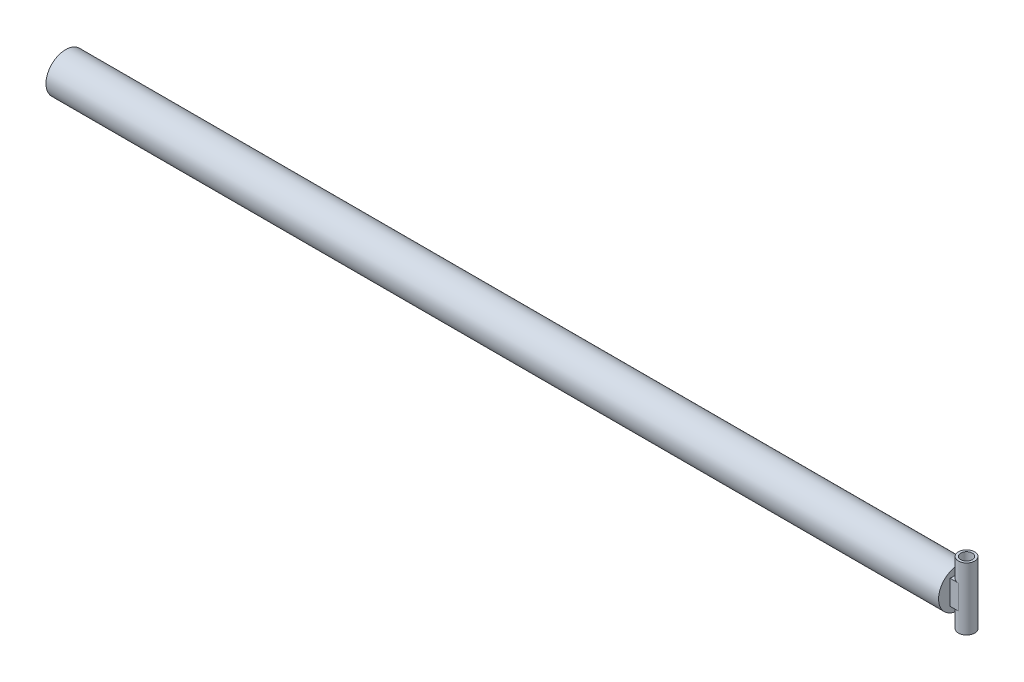
ISO-10303-21;
HEADER;
FILE_DESCRIPTION(('STEP AP214'),'2;1');
FILE_NAME('part.step','',(''),(''),'','','');
FILE_SCHEMA(('AUTOMOTIVE_DESIGN { 1 0 10303 214 1 1 1 1 }'));
ENDSEC;
DATA;
#1=APPLICATION_CONTEXT('core data for automotive mechanical design processes');
#2=APPLICATION_PROTOCOL_DEFINITION('international standard','automotive_design',2000,#1);
#3=PRODUCT_CONTEXT('',#1,'mechanical');
#4=PRODUCT('Part','Part','',(#3));
#5=PRODUCT_RELATED_PRODUCT_CATEGORY('part','',(#4));
#6=PRODUCT_DEFINITION_FORMATION('','',#4);
#7=PRODUCT_DEFINITION_CONTEXT('part definition',#1,'design');
#8=PRODUCT_DEFINITION('design','',#6,#7);
#9=PRODUCT_DEFINITION_SHAPE('','',#8);
#10=(LENGTH_UNIT() NAMED_UNIT(*) SI_UNIT(.MILLI.,.METRE.));
#11=(NAMED_UNIT(*) PLANE_ANGLE_UNIT() SI_UNIT($,.RADIAN.));
#12=(NAMED_UNIT(*) SI_UNIT($,.STERADIAN.) SOLID_ANGLE_UNIT());
#13=UNCERTAINTY_MEASURE_WITH_UNIT(LENGTH_MEASURE(1.E-05),#10,'distance_accuracy_value','');
#14=(GEOMETRIC_REPRESENTATION_CONTEXT(3) GLOBAL_UNCERTAINTY_ASSIGNED_CONTEXT((#13)) GLOBAL_UNIT_ASSIGNED_CONTEXT((#10,
#11,#12)) REPRESENTATION_CONTEXT('',''));
#15=CARTESIAN_POINT('',(0.,0.,0.));
#16=DIRECTION('',(0.,0.,1.));
#17=DIRECTION('',(1.,0.,0.));
#18=AXIS2_PLACEMENT_3D('',#15,#16,#17);
#19=CARTESIAN_POINT('',(1930.,0.,0.));
#20=DIRECTION('',(-1.,0.,0.));
#21=DIRECTION('',(0.,0.,1.));
#22=AXIS2_PLACEMENT_3D('',#19,#20,#21);
#23=PLANE('',#22);
#24=CARTESIAN_POINT('',(1930.,0.,0.));
#25=DIRECTION('',(1.,0.,0.));
#26=DIRECTION('',(0.,0.,-1.));
#27=AXIS2_PLACEMENT_3D('',#24,#25,#26);
#28=CIRCLE('',#27,84.9999999999995);
#29=CARTESIAN_POINT('',(1930.,0.,-84.9999999999995));
#30=VERTEX_POINT('',#29);
#31=EDGE_CURVE('E115',#30,#30,#28,.T.);
#32=ORIENTED_EDGE('',*,*,#31,.T.);
#33=EDGE_LOOP('',(#32));
#34=FACE_BOUND('',#33,.T.);
#35=DIRECTION('',(0.,0.,1.));
#36=VECTOR('',#35,1.);
#37=CARTESIAN_POINT('',(1930.,52.5,-35.));
#38=LINE('',#37,#36);
#39=CARTESIAN_POINT('',(1930.,52.5,-35.));
#40=VERTEX_POINT('',#39);
#41=CARTESIAN_POINT('',(1930.,52.5,35.));
#42=VERTEX_POINT('',#41);
#43=EDGE_CURVE('E63',#40,#42,#38,.T.);
#44=ORIENTED_EDGE('',*,*,#43,.F.);
#45=DIRECTION('',(0.,1.,0.));
#46=VECTOR('',#45,1.);
#47=CARTESIAN_POINT('',(1930.,52.5,-35.));
#48=LINE('',#47,#46);
#49=CARTESIAN_POINT('',(1930.,-52.5,-35.));
#50=VERTEX_POINT('',#49);
#51=EDGE_CURVE('E68',#50,#40,#48,.T.);
#52=ORIENTED_EDGE('',*,*,#51,.F.);
#53=DIRECTION('',(0.,0.,-1.));
#54=VECTOR('',#53,1.);
#55=CARTESIAN_POINT('',(1930.,-52.5,-35.));
#56=LINE('',#55,#54);
#57=CARTESIAN_POINT('',(1930.,-52.5,35.));
#58=VERTEX_POINT('',#57);
#59=EDGE_CURVE('E194',#58,#50,#56,.T.);
#60=ORIENTED_EDGE('',*,*,#59,.F.);
#61=DIRECTION('',(0.,-1.,0.));
#62=VECTOR('',#61,1.);
#63=CARTESIAN_POINT('',(1930.,52.5,35.));
#64=LINE('',#63,#62);
#65=EDGE_CURVE('E197',#42,#58,#64,.T.);
#66=ORIENTED_EDGE('',*,*,#65,.F.);
#67=EDGE_LOOP('',(#44,#52,#60,#66));
#68=FACE_BOUND('',#67,.T.);
#69=ADVANCED_FACE('F48',(#34,#68),#23,.F.);
#70=CARTESIAN_POINT('',(-1930.,0.,0.));
#71=DIRECTION('',(1.,0.,0.));
#72=DIRECTION('',(0.,0.,-1.));
#73=AXIS2_PLACEMENT_3D('',#70,#71,#72);
#74=PLANE('',#73);
#75=CARTESIAN_POINT('',(-1930.,0.,0.));
#76=DIRECTION('',(1.,0.,0.));
#77=DIRECTION('',(0.,0.,-1.));
#78=AXIS2_PLACEMENT_3D('',#75,#76,#77);
#79=CIRCLE('',#78,84.9999999999995);
#80=CARTESIAN_POINT('',(-1930.,0.,-84.9999999999995));
#81=VERTEX_POINT('',#80);
#82=EDGE_CURVE('E118',#81,#81,#79,.T.);
#83=ORIENTED_EDGE('',*,*,#82,.F.);
#84=EDGE_LOOP('',(#83));
#85=FACE_BOUND('',#84,.T.);
#86=CARTESIAN_POINT('',(-1930.,0.,0.));
#87=DIRECTION('',(-1.,0.,0.));
#88=DIRECTION('',(0.,0.,1.));
#89=AXIS2_PLACEMENT_3D('',#86,#87,#88);
#90=CIRCLE('',#89,18.75);
#91=CARTESIAN_POINT('',(-1930.,0.,18.75));
#92=VERTEX_POINT('',#91);
#93=EDGE_CURVE('E186',#92,#92,#90,.T.);
#94=ORIENTED_EDGE('',*,*,#93,.F.);
#95=EDGE_LOOP('',(#94));
#96=FACE_BOUND('',#95,.T.);
#97=ADVANCED_FACE('F50',(#85,#96),#74,.F.);
#98=CARTESIAN_POINT('',(-1930.,0.,0.));
#99=DIRECTION('',(-1.,0.,0.));
#100=DIRECTION('',(0.,0.,1.));
#101=AXIS2_PLACEMENT_3D('',#98,#99,#100);
#102=CYLINDRICAL_SURFACE('',#101,84.9999999999995);
#103=ORIENTED_EDGE('',*,*,#82,.T.);
#104=EDGE_LOOP('',(#103));
#105=FACE_BOUND('',#104,.T.);
#106=ORIENTED_EDGE('',*,*,#31,.F.);
#107=EDGE_LOOP('',(#106));
#108=FACE_BOUND('',#107,.T.);
#109=ADVANCED_FACE('F154',(#105,#108),#102,.T.);
#110=CARTESIAN_POINT('',(2001.002,52.5,35.));
#111=DIRECTION('',(0.,0.,-1.));
#112=DIRECTION('',(-1.,0.,0.));
#113=AXIS2_PLACEMENT_3D('',#110,#111,#112);
#114=PLANE('',#113);
#115=DIRECTION('',(-1.,0.,0.));
#116=VECTOR('',#115,1.);
#117=CARTESIAN_POINT('',(2001.002,-52.5,35.));
#118=LINE('',#117,#116);
#119=CARTESIAN_POINT('',(1966.,-52.5,35.));
#120=VERTEX_POINT('',#119);
#121=EDGE_CURVE('E204',#120,#58,#118,.T.);
#122=ORIENTED_EDGE('',*,*,#121,.F.);
#123=DIRECTION('',(0.,1.,0.));
#124=VECTOR('',#123,1.);
#125=CARTESIAN_POINT('',(1966.,-135.,34.9999999999997));
#126=LINE('',#125,#124);
#127=CARTESIAN_POINT('',(1966.,52.5,35.));
#128=VERTEX_POINT('',#127);
#129=EDGE_CURVE('E103',#120,#128,#126,.T.);
#130=ORIENTED_EDGE('',*,*,#129,.T.);
#131=DIRECTION('',(-1.,0.,0.));
#132=VECTOR('',#131,1.);
#133=CARTESIAN_POINT('',(2001.002,52.5,35.));
#134=LINE('',#133,#132);
#135=EDGE_CURVE('E100',#128,#42,#134,.T.);
#136=ORIENTED_EDGE('',*,*,#135,.T.);
#137=ORIENTED_EDGE('',*,*,#65,.T.);
#138=EDGE_LOOP('',(#122,#130,#136,#137));
#139=FACE_BOUND('',#138,.T.);
#140=ADVANCED_FACE('F159',(#139),#114,.F.);
#141=CARTESIAN_POINT('',(2001.002,52.5,-35.));
#142=DIRECTION('',(0.,-1.,0.));
#143=DIRECTION('',(0.,0.,-1.));
#144=AXIS2_PLACEMENT_3D('',#141,#142,#143);
#145=PLANE('',#144);
#146=ORIENTED_EDGE('',*,*,#135,.F.);
#147=CARTESIAN_POINT('',(1966.,52.5,0.));
#148=DIRECTION('',(0.,-1.,0.));
#149=DIRECTION('',(0.,0.,-1.));
#150=AXIS2_PLACEMENT_3D('',#147,#148,#149);
#151=CIRCLE('',#150,34.9999999999994);
#152=CARTESIAN_POINT('',(1966.,52.5,-34.9999999999997));
#153=VERTEX_POINT('',#152);
#154=EDGE_CURVE('E97',#128,#153,#151,.T.);
#155=ORIENTED_EDGE('',*,*,#154,.T.);
#156=DIRECTION('',(-1.,0.,0.));
#157=VECTOR('',#156,1.);
#158=CARTESIAN_POINT('',(2001.002,52.5,-35.));
#159=LINE('',#158,#157);
#160=EDGE_CURVE('E86',#153,#40,#159,.T.);
#161=ORIENTED_EDGE('',*,*,#160,.T.);
#162=ORIENTED_EDGE('',*,*,#43,.T.);
#163=EDGE_LOOP('',(#146,#155,#161,#162));
#164=FACE_BOUND('',#163,.T.);
#165=ADVANCED_FACE('F98',(#164),#145,.F.);
#166=CARTESIAN_POINT('',(2001.002,-52.5,-35.));
#167=DIRECTION('',(0.,1.,0.));
#168=DIRECTION('',(0.,0.,1.));
#169=AXIS2_PLACEMENT_3D('',#166,#167,#168);
#170=PLANE('',#169);
#171=DIRECTION('',(-1.,0.,0.));
#172=VECTOR('',#171,1.);
#173=CARTESIAN_POINT('',(2001.002,-52.5,-35.));
#174=LINE('',#173,#172);
#175=CARTESIAN_POINT('',(1966.,-52.5,-35.));
#176=VERTEX_POINT('',#175);
#177=EDGE_CURVE('E93',#176,#50,#174,.T.);
#178=ORIENTED_EDGE('',*,*,#177,.F.);
#179=CARTESIAN_POINT('',(1966.,-52.5,0.));
#180=DIRECTION('',(0.,1.,0.));
#181=DIRECTION('',(0.,0.,1.));
#182=AXIS2_PLACEMENT_3D('',#179,#180,#181);
#183=CIRCLE('',#182,34.9999999999994);
#184=EDGE_CURVE('E107',#176,#120,#183,.T.);
#185=ORIENTED_EDGE('',*,*,#184,.T.);
#186=ORIENTED_EDGE('',*,*,#121,.T.);
#187=ORIENTED_EDGE('',*,*,#59,.T.);
#188=EDGE_LOOP('',(#178,#185,#186,#187));
#189=FACE_BOUND('',#188,.T.);
#190=ADVANCED_FACE('F209',(#189),#170,.F.);
#191=CARTESIAN_POINT('',(2001.002,52.5,-35.));
#192=DIRECTION('',(0.,0.,1.));
#193=DIRECTION('',(1.,0.,0.));
#194=AXIS2_PLACEMENT_3D('',#191,#192,#193);
#195=PLANE('',#194);
#196=DIRECTION('',(0.,1.,0.));
#197=VECTOR('',#196,1.);
#198=CARTESIAN_POINT('',(1966.,-135.,-34.9999999999997));
#199=LINE('',#198,#197);
#200=EDGE_CURVE('E90',#176,#153,#199,.T.);
#201=ORIENTED_EDGE('',*,*,#200,.F.);
#202=ORIENTED_EDGE('',*,*,#177,.T.);
#203=ORIENTED_EDGE('',*,*,#51,.T.);
#204=ORIENTED_EDGE('',*,*,#160,.F.);
#205=EDGE_LOOP('',(#201,#202,#203,#204));
#206=FACE_BOUND('',#205,.T.);
#207=ADVANCED_FACE('F88',(#206),#195,.F.);
#208=CARTESIAN_POINT('',(1966.,-135.,0.));
#209=DIRECTION('',(0.,1.,0.));
#210=DIRECTION('',(0.,0.,1.));
#211=AXIS2_PLACEMENT_3D('',#208,#209,#210);
#212=CYLINDRICAL_SURFACE('',#211,34.9999999999994);
#213=CARTESIAN_POINT('',(1966.,135.,0.));
#214=DIRECTION('',(0.,1.,0.));
#215=DIRECTION('',(0.,0.,1.));
#216=AXIS2_PLACEMENT_3D('',#213,#214,#215);
#217=CIRCLE('',#216,34.9999999999994);
#218=CARTESIAN_POINT('',(1966.,135.,34.9999999999994));
#219=VERTEX_POINT('',#218);
#220=EDGE_CURVE('E183',#219,#219,#217,.T.);
#221=ORIENTED_EDGE('',*,*,#220,.F.);
#222=EDGE_LOOP('',(#221));
#223=FACE_BOUND('',#222,.T.);
#224=CARTESIAN_POINT('',(1966.,-135.,0.));
#225=DIRECTION('',(0.,1.,0.));
#226=DIRECTION('',(0.,0.,1.));
#227=AXIS2_PLACEMENT_3D('',#224,#225,#226);
#228=CIRCLE('',#227,34.9999999999994);
#229=CARTESIAN_POINT('',(1966.,-135.,34.9999999999994));
#230=VERTEX_POINT('',#229);
#231=EDGE_CURVE('E108',#230,#230,#228,.T.);
#232=ORIENTED_EDGE('',*,*,#231,.T.);
#233=EDGE_LOOP('',(#232));
#234=FACE_BOUND('',#233,.T.);
#235=ORIENTED_EDGE('',*,*,#129,.F.);
#236=ORIENTED_EDGE('',*,*,#184,.F.);
#237=ORIENTED_EDGE('',*,*,#200,.T.);
#238=ORIENTED_EDGE('',*,*,#154,.F.);
#239=EDGE_LOOP('',(#235,#236,#237,#238));
#240=FACE_BOUND('',#239,.T.);
#241=ADVANCED_FACE('F106',(#223,#234,#240),#212,.T.);
#242=CARTESIAN_POINT('',(1966.,-135.,0.));
#243=DIRECTION('',(0.,1.,0.));
#244=DIRECTION('',(0.,0.,1.));
#245=AXIS2_PLACEMENT_3D('',#242,#243,#244);
#246=PLANE('',#245);
#247=CARTESIAN_POINT('',(1966.,-135.,0.));
#248=DIRECTION('',(0.,1.,0.));
#249=DIRECTION('',(0.,0.,1.));
#250=AXIS2_PLACEMENT_3D('',#247,#248,#249);
#251=CIRCLE('',#250,25.);
#252=CARTESIAN_POINT('',(1966.,-135.,25.));
#253=VERTEX_POINT('',#252);
#254=EDGE_CURVE('E111',#253,#253,#251,.T.);
#255=ORIENTED_EDGE('',*,*,#254,.T.);
#256=EDGE_LOOP('',(#255));
#257=FACE_BOUND('',#256,.T.);
#258=ORIENTED_EDGE('',*,*,#231,.F.);
#259=EDGE_LOOP('',(#258));
#260=FACE_BOUND('',#259,.T.);
#261=ADVANCED_FACE('F248',(#257,#260),#246,.F.);
#262=CARTESIAN_POINT('',(1966.,-135.,0.));
#263=DIRECTION('',(0.,1.,0.));
#264=DIRECTION('',(0.,0.,1.));
#265=AXIS2_PLACEMENT_3D('',#262,#263,#264);
#266=CYLINDRICAL_SURFACE('',#265,25.);
#267=ORIENTED_EDGE('',*,*,#254,.F.);
#268=EDGE_LOOP('',(#267));
#269=FACE_BOUND('',#268,.T.);
#270=CARTESIAN_POINT('',(1966.,135.,0.));
#271=DIRECTION('',(0.,1.,0.));
#272=DIRECTION('',(0.,0.,1.));
#273=AXIS2_PLACEMENT_3D('',#270,#271,#272);
#274=CIRCLE('',#273,25.);
#275=CARTESIAN_POINT('',(1966.,135.,25.));
#276=VERTEX_POINT('',#275);
#277=EDGE_CURVE('E179',#276,#276,#274,.T.);
#278=ORIENTED_EDGE('',*,*,#277,.T.);
#279=EDGE_LOOP('',(#278));
#280=FACE_BOUND('',#279,.T.);
#281=ADVANCED_FACE('F245',(#269,#280),#266,.F.);
#282=CARTESIAN_POINT('',(1966.,135.,0.));
#283=DIRECTION('',(0.,1.,0.));
#284=DIRECTION('',(0.,0.,1.));
#285=AXIS2_PLACEMENT_3D('',#282,#283,#284);
#286=PLANE('',#285);
#287=ORIENTED_EDGE('',*,*,#220,.T.);
#288=EDGE_LOOP('',(#287));
#289=FACE_BOUND('',#288,.T.);
#290=ORIENTED_EDGE('',*,*,#277,.F.);
#291=EDGE_LOOP('',(#290));
#292=FACE_BOUND('',#291,.T.);
#293=ADVANCED_FACE('F237',(#289,#292),#286,.T.);
#294=CARTESIAN_POINT('',(-1920.,0.,0.));
#295=DIRECTION('',(-1.,0.,0.));
#296=DIRECTION('',(0.,0.,1.));
#297=AXIS2_PLACEMENT_3D('',#294,#295,#296);
#298=PLANE('',#297);
#299=CARTESIAN_POINT('',(-1920.,0.,0.));
#300=DIRECTION('',(-1.,0.,0.));
#301=DIRECTION('',(0.,0.,1.));
#302=AXIS2_PLACEMENT_3D('',#299,#300,#301);
#303=CIRCLE('',#302,18.75);
#304=CARTESIAN_POINT('',(-1920.,0.,18.75));
#305=VERTEX_POINT('',#304);
#306=EDGE_CURVE('E180',#305,#305,#303,.T.);
#307=ORIENTED_EDGE('',*,*,#306,.T.);
#308=EDGE_LOOP('',(#307));
#309=FACE_BOUND('',#308,.T.);
#310=CARTESIAN_POINT('',(-1920.,0.,0.));
#311=DIRECTION('',(-1.,0.,0.));
#312=DIRECTION('',(0.,0.,1.));
#313=AXIS2_PLACEMENT_3D('',#310,#311,#312);
#314=CIRCLE('',#313,64.9999999999998);
#315=CARTESIAN_POINT('',(-1920.,0.,64.9999999999998));
#316=VERTEX_POINT('',#315);
#317=EDGE_CURVE('E177',#316,#316,#314,.T.);
#318=ORIENTED_EDGE('',*,*,#317,.F.);
#319=EDGE_LOOP('',(#318));
#320=FACE_BOUND('',#319,.T.);
#321=ADVANCED_FACE('F230',(#309,#320),#298,.F.);
#322=CARTESIAN_POINT('',(-1920.,0.,0.));
#323=DIRECTION('',(-1.,0.,0.));
#324=DIRECTION('',(0.,0.,1.));
#325=AXIS2_PLACEMENT_3D('',#322,#323,#324);
#326=CYLINDRICAL_SURFACE('',#325,18.75);
#327=ORIENTED_EDGE('',*,*,#306,.F.);
#328=EDGE_LOOP('',(#327));
#329=FACE_BOUND('',#328,.T.);
#330=ORIENTED_EDGE('',*,*,#93,.T.);
#331=EDGE_LOOP('',(#330));
#332=FACE_BOUND('',#331,.T.);
#333=ADVANCED_FACE('F225',(#329,#332),#326,.F.);
#334=CARTESIAN_POINT('',(1920.,0.,0.));
#335=DIRECTION('',(-1.,0.,0.));
#336=DIRECTION('',(0.,0.,1.));
#337=AXIS2_PLACEMENT_3D('',#334,#335,#336);
#338=PLANE('',#337);
#339=CARTESIAN_POINT('',(1920.,0.,0.));
#340=DIRECTION('',(-1.,0.,0.));
#341=DIRECTION('',(0.,0.,1.));
#342=AXIS2_PLACEMENT_3D('',#339,#340,#341);
#343=CIRCLE('',#342,65.);
#344=CARTESIAN_POINT('',(1920.,0.,65.));
#345=VERTEX_POINT('',#344);
#346=EDGE_CURVE('E13',#345,#345,#343,.T.);
#347=ORIENTED_EDGE('',*,*,#346,.T.);
#348=EDGE_LOOP('',(#347));
#349=FACE_BOUND('',#348,.T.);
#350=ADVANCED_FACE('F147',(#349),#338,.T.);
#351=CARTESIAN_POINT('',(-1930.,0.,0.));
#352=DIRECTION('',(-1.,0.,0.));
#353=DIRECTION('',(0.,0.,1.));
#354=AXIS2_PLACEMENT_3D('',#351,#352,#353);
#355=CYLINDRICAL_SURFACE('',#354,65.);
#356=CARTESIAN_POINT('',(1890.,0.,0.));
#357=DIRECTION('',(-1.,0.,0.));
#358=DIRECTION('',(0.,0.,1.));
#359=AXIS2_PLACEMENT_3D('',#356,#357,#358);
#360=CIRCLE('',#359,65.);
#361=CARTESIAN_POINT('',(1890.,0.,65.));
#362=VERTEX_POINT('',#361);
#363=EDGE_CURVE('E56',#362,#362,#360,.T.);
#364=ORIENTED_EDGE('',*,*,#363,.T.);
#365=EDGE_LOOP('',(#364));
#366=FACE_BOUND('',#365,.T.);
#367=ORIENTED_EDGE('',*,*,#346,.F.);
#368=EDGE_LOOP('',(#367));
#369=FACE_BOUND('',#368,.T.);
#370=ADVANCED_FACE('F132',(#366,#369),#355,.F.);
#371=CARTESIAN_POINT('',(1890.,0.,0.));
#372=DIRECTION('',(-1.,0.,0.));
#373=DIRECTION('',(0.,0.,1.));
#374=AXIS2_PLACEMENT_3D('',#371,#372,#373);
#375=PLANE('',#374);
#376=CARTESIAN_POINT('',(1890.,0.,0.));
#377=DIRECTION('',(-1.,0.,0.));
#378=DIRECTION('',(0.,0.,1.));
#379=AXIS2_PLACEMENT_3D('',#376,#377,#378);
#380=CIRCLE('',#379,74.9999999999995);
#381=CARTESIAN_POINT('',(1890.,0.,74.9999999999995));
#382=VERTEX_POINT('',#381);
#383=EDGE_CURVE('E127',#382,#382,#380,.T.);
#384=ORIENTED_EDGE('',*,*,#383,.T.);
#385=EDGE_LOOP('',(#384));
#386=FACE_BOUND('',#385,.T.);
#387=ORIENTED_EDGE('',*,*,#363,.F.);
#388=EDGE_LOOP('',(#387));
#389=FACE_BOUND('',#388,.T.);
#390=ADVANCED_FACE('F135',(#386,#389),#375,.T.);
#391=CARTESIAN_POINT('',(-1930.,0.,0.));
#392=DIRECTION('',(-1.,0.,0.));
#393=DIRECTION('',(0.,0.,1.));
#394=AXIS2_PLACEMENT_3D('',#391,#392,#393);
#395=CYLINDRICAL_SURFACE('',#394,74.9999999999995);
#396=CARTESIAN_POINT('',(-1890.,0.,0.));
#397=DIRECTION('',(1.,0.,0.));
#398=DIRECTION('',(0.,0.,-1.));
#399=AXIS2_PLACEMENT_3D('',#396,#397,#398);
#400=CIRCLE('',#399,74.9999999999995);
#401=CARTESIAN_POINT('',(-1890.,0.,-74.9999999999995));
#402=VERTEX_POINT('',#401);
#403=EDGE_CURVE('E124',#402,#402,#400,.F.);
#404=ORIENTED_EDGE('',*,*,#403,.T.);
#405=EDGE_LOOP('',(#404));
#406=FACE_BOUND('',#405,.T.);
#407=ORIENTED_EDGE('',*,*,#383,.F.);
#408=EDGE_LOOP('',(#407));
#409=FACE_BOUND('',#408,.T.);
#410=ADVANCED_FACE('F137',(#406,#409),#395,.F.);
#411=CARTESIAN_POINT('',(-1890.,0.,0.));
#412=DIRECTION('',(1.,0.,0.));
#413=DIRECTION('',(0.,0.,-1.));
#414=AXIS2_PLACEMENT_3D('',#411,#412,#413);
#415=PLANE('',#414);
#416=CARTESIAN_POINT('',(-1890.,0.,0.));
#417=DIRECTION('',(1.,0.,0.));
#418=DIRECTION('',(0.,0.,-1.));
#419=AXIS2_PLACEMENT_3D('',#416,#417,#418);
#420=CIRCLE('',#419,65.);
#421=CARTESIAN_POINT('',(-1890.,0.,-65.));
#422=VERTEX_POINT('',#421);
#423=EDGE_CURVE('E121',#422,#422,#420,.F.);
#424=ORIENTED_EDGE('',*,*,#423,.T.);
#425=EDGE_LOOP('',(#424));
#426=FACE_BOUND('',#425,.T.);
#427=ORIENTED_EDGE('',*,*,#403,.F.);
#428=EDGE_LOOP('',(#427));
#429=FACE_BOUND('',#428,.T.);
#430=ADVANCED_FACE('F144',(#426,#429),#415,.T.);
#431=CARTESIAN_POINT('',(-1930.,0.,0.));
#432=DIRECTION('',(-1.,0.,0.));
#433=DIRECTION('',(0.,0.,1.));
#434=AXIS2_PLACEMENT_3D('',#431,#432,#433);
#435=CYLINDRICAL_SURFACE('',#434,65.);
#436=ORIENTED_EDGE('',*,*,#423,.F.);
#437=EDGE_LOOP('',(#436));
#438=FACE_BOUND('',#437,.T.);
#439=ORIENTED_EDGE('',*,*,#317,.T.);
#440=EDGE_LOOP('',(#439));
#441=FACE_BOUND('',#440,.T.);
#442=ADVANCED_FACE('F162',(#438,#441),#435,.F.);
#443=CLOSED_SHELL('',(#69,#97,#109,#140,#165,#190,#207,#241,#261,#281,#293,#321,#333,#350,#370,
#390,#410,#430,#442));
#444=MANIFOLD_SOLID_BREP('B2',#443);
#445=ADVANCED_BREP_SHAPE_REPRESENTATION('',(#18,#444),#14);
#446=SHAPE_DEFINITION_REPRESENTATION(#9,#445);
ENDSEC;
END-ISO-10303-21;
